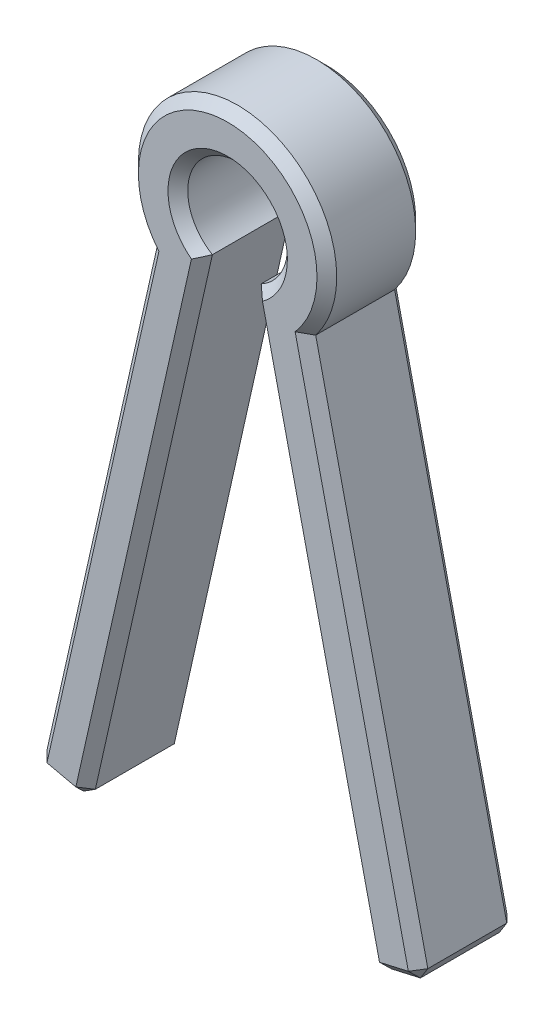
ISO-10303-21;
HEADER;
FILE_DESCRIPTION(('STEP AP214'),'2;1');
FILE_NAME('part.step','',(''),(''),'','','');
FILE_SCHEMA(('AUTOMOTIVE_DESIGN { 1 0 10303 214 1 1 1 1 }'));
ENDSEC;
DATA;
#1=APPLICATION_CONTEXT('core data for automotive mechanical design processes');
#2=APPLICATION_PROTOCOL_DEFINITION('international standard','automotive_design',2000,#1);
#3=PRODUCT_CONTEXT('',#1,'mechanical');
#4=PRODUCT('Part','Part','',(#3));
#5=PRODUCT_RELATED_PRODUCT_CATEGORY('part','',(#4));
#6=PRODUCT_DEFINITION_FORMATION('','',#4);
#7=PRODUCT_DEFINITION_CONTEXT('part definition',#1,'design');
#8=PRODUCT_DEFINITION('design','',#6,#7);
#9=PRODUCT_DEFINITION_SHAPE('','',#8);
#10=(LENGTH_UNIT() NAMED_UNIT(*) SI_UNIT(.MILLI.,.METRE.));
#11=(NAMED_UNIT(*) PLANE_ANGLE_UNIT() SI_UNIT($,.RADIAN.));
#12=(NAMED_UNIT(*) SI_UNIT($,.STERADIAN.) SOLID_ANGLE_UNIT());
#13=UNCERTAINTY_MEASURE_WITH_UNIT(LENGTH_MEASURE(1.E-05),#10,'distance_accuracy_value','');
#14=(GEOMETRIC_REPRESENTATION_CONTEXT(3) GLOBAL_UNCERTAINTY_ASSIGNED_CONTEXT((#13)) GLOBAL_UNIT_ASSIGNED_CONTEXT((#10,
#11,#12)) REPRESENTATION_CONTEXT('',''));
#15=CARTESIAN_POINT('',(0.,0.,0.));
#16=DIRECTION('',(0.,0.,1.));
#17=DIRECTION('',(1.,0.,0.));
#18=AXIS2_PLACEMENT_3D('',#15,#16,#17);
#19=CARTESIAN_POINT('',(-7.42970161226494,-3.26346952908523,10.));
#20=DIRECTION('',(0.975732833497163,-0.218964466604965,0.));
#21=DIRECTION('',(0.218964466604965,0.975732833497163,0.));
#22=AXIS2_PLACEMENT_3D('',#19,#20,#21);
#23=PLANE('',#22);
#24=DIRECTION('',(0.,0.,-1.));
#25=VECTOR('',#24,1.);
#26=CARTESIAN_POINT('',(-8.04810955980083,-6.01917207873661,10.));
#27=LINE('',#26,#25);
#28=CARTESIAN_POINT('',(-8.04810955980083,-6.01917207873661,8.99999999999999));
#29=VERTEX_POINT('',#28);
#30=CARTESIAN_POINT('',(-8.04810955980083,-6.01917207873661,1.00000000000001));
#31=VERTEX_POINT('',#30);
#32=EDGE_CURVE('E482',#29,#31,#27,.T.);
#33=ORIENTED_EDGE('',*,*,#32,.T.);
#34=DIRECTION('',(-0.218964466604965,-0.975732833497163,0.));
#35=VECTOR('',#34,1.);
#36=CARTESIAN_POINT('',(-7.42970161226494,-3.26346952908523,1.00000000000001));
#37=LINE('',#36,#35);
#38=CARTESIAN_POINT('',(-19.2908427998453,-56.1181864560429,1.00000000000001));
#39=VERTEX_POINT('',#38);
#40=EDGE_CURVE('E270',#31,#39,#37,.T.);
#41=ORIENTED_EDGE('',*,*,#40,.T.);
#42=DIRECTION('',(0.,0.,1.));
#43=VECTOR('',#42,1.);
#44=CARTESIAN_POINT('',(-19.2908427998453,-56.1181864560429,10.));
#45=LINE('',#44,#43);
#46=CARTESIAN_POINT('',(-19.2908427998453,-56.1181864560429,8.99999999999999));
#47=VERTEX_POINT('',#46);
#48=EDGE_CURVE('E266',#39,#47,#45,.T.);
#49=ORIENTED_EDGE('',*,*,#48,.T.);
#50=DIRECTION('',(0.218964466604965,0.975732833497163,0.));
#51=VECTOR('',#50,1.);
#52=CARTESIAN_POINT('',(-8.04810955980083,-6.01917207873661,8.99999999999999));
#53=LINE('',#52,#51);
#54=EDGE_CURVE('E268',#47,#29,#53,.T.);
#55=ORIENTED_EDGE('',*,*,#54,.T.);
#56=EDGE_LOOP('',(#33,#41,#49,#55));
#57=FACE_BOUND('',#56,.T.);
#58=ADVANCED_FACE('F43',(#57),#23,.F.);
#59=CARTESIAN_POINT('',(-14.6311430989645,-58.188741622565,10.));
#60=DIRECTION('',(-0.218964466604966,-0.975732833497163,0.));
#61=DIRECTION('',(0.975732833497163,-0.218964466604966,0.));
#62=AXIS2_PLACEMENT_3D('',#59,#60,#61);
#63=PLANE('',#62);
#64=DIRECTION('',(0.,0.,-1.));
#65=VECTOR('',#64,1.);
#66=CARTESIAN_POINT('',(-18.5340744329531,-57.3128837561451,0.));
#67=LINE('',#66,#65);
#68=CARTESIAN_POINT('',(-18.5340744329531,-57.3128837561451,8.99999999999999));
#69=VERTEX_POINT('',#68);
#70=CARTESIAN_POINT('',(-18.5340744329531,-57.3128837561451,1.00000000000001));
#71=VERTEX_POINT('',#70);
#72=EDGE_CURVE('E217',#69,#71,#67,.T.);
#73=ORIENTED_EDGE('',*,*,#72,.T.);
#74=DIRECTION('',(0.975732833497163,-0.218964466604966,0.));
#75=VECTOR('',#74,1.);
#76=CARTESIAN_POINT('',(-14.6311430989645,-58.188741622565,1.00000000000001));
#77=LINE('',#76,#75);
#78=CARTESIAN_POINT('',(-15.6068759324617,-57.96977715596,1.00000000000001));
#79=VERTEX_POINT('',#78);
#80=EDGE_CURVE('E188',#71,#79,#77,.T.);
#81=ORIENTED_EDGE('',*,*,#80,.T.);
#82=DIRECTION('',(0.,0.,1.));
#83=VECTOR('',#82,1.);
#84=CARTESIAN_POINT('',(-15.6068759324617,-57.96977715596,10.));
#85=LINE('',#84,#83);
#86=CARTESIAN_POINT('',(-15.6068759324617,-57.96977715596,8.99999999999999));
#87=VERTEX_POINT('',#86);
#88=EDGE_CURVE('E226',#79,#87,#85,.T.);
#89=ORIENTED_EDGE('',*,*,#88,.T.);
#90=DIRECTION('',(-0.975732833497163,0.218964466604966,0.));
#91=VECTOR('',#90,1.);
#92=CARTESIAN_POINT('',(-14.6311430989645,-58.188741622565,8.99999999999999));
#93=LINE('',#92,#91);
#94=EDGE_CURVE('E219',#87,#69,#93,.T.);
#95=ORIENTED_EDGE('',*,*,#94,.T.);
#96=EDGE_LOOP('',(#73,#81,#89,#95));
#97=FACE_BOUND('',#96,.T.);
#98=ADVANCED_FACE('F526',(#97),#63,.T.);
#99=CARTESIAN_POINT('',(-2.55103744477913,-4.35829186211006,10.));
#100=DIRECTION('',(0.975732833497163,-0.218964466604965,0.));
#101=DIRECTION('',(0.218964466604965,0.975732833497163,0.));
#102=AXIS2_PLACEMENT_3D('',#99,#100,#101);
#103=PLANE('',#102);
#104=DIRECTION('',(0.,0.,-1.));
#105=VECTOR('',#104,1.);
#106=CARTESIAN_POINT('',(-14.4121786323595,-57.2130087890678,10.));
#107=LINE('',#106,#105);
#108=CARTESIAN_POINT('',(-14.4121786323595,-57.2130087890678,8.99999999999999));
#109=VERTEX_POINT('',#108);
#110=CARTESIAN_POINT('',(-14.4121786323595,-57.2130087890678,1.00000000000001));
#111=VERTEX_POINT('',#110);
#112=EDGE_CURVE('E229',#109,#111,#107,.T.);
#113=ORIENTED_EDGE('',*,*,#112,.T.);
#114=DIRECTION('',(0.218964466604965,0.975732833497163,0.));
#115=VECTOR('',#114,1.);
#116=CARTESIAN_POINT('',(-2.55103744477913,-4.35829186211006,1.00000000000001));
#117=LINE('',#116,#115);
#118=CARTESIAN_POINT('',(-2.55103744477913,-4.35829186211006,1.00000000000001));
#119=VERTEX_POINT('',#118);
#120=EDGE_CURVE('E233',#111,#119,#117,.T.);
#121=ORIENTED_EDGE('',*,*,#120,.T.);
#122=DIRECTION('',(0.,0.,-1.));
#123=VECTOR('',#122,1.);
#124=CARTESIAN_POINT('',(-2.55103744477913,-4.35829186211006,10.));
#125=LINE('',#124,#123);
#126=CARTESIAN_POINT('',(-2.55103744477913,-4.35829186211006,8.99999999999999));
#127=VERTEX_POINT('',#126);
#128=EDGE_CURVE('E211',#127,#119,#125,.T.);
#129=ORIENTED_EDGE('',*,*,#128,.F.);
#130=DIRECTION('',(-0.218964466604965,-0.975732833497163,0.));
#131=VECTOR('',#130,1.);
#132=CARTESIAN_POINT('',(-2.55103744477913,-4.35829186211006,8.99999999999999));
#133=LINE('',#132,#131);
#134=EDGE_CURVE('E231',#127,#109,#133,.T.);
#135=ORIENTED_EDGE('',*,*,#134,.T.);
#136=EDGE_LOOP('',(#113,#121,#129,#135));
#137=FACE_BOUND('',#136,.T.);
#138=ADVANCED_FACE('F596',(#137),#103,.T.);
#139=CARTESIAN_POINT('',(0.,0.,10.));
#140=DIRECTION('',(0.,0.,-1.));
#141=DIRECTION('',(-1.,0.,0.));
#142=AXIS2_PLACEMENT_3D('',#139,#140,#141);
#143=CYLINDRICAL_SURFACE('',#142,5.05);
#144=ORIENTED_EDGE('',*,*,#128,.T.);
#145=CARTESIAN_POINT('',(0.,0.,1.00000000000001));
#146=DIRECTION('',(0.,0.,1.));
#147=DIRECTION('',(1.,0.,0.));
#148=AXIS2_PLACEMENT_3D('',#145,#146,#147);
#149=CIRCLE('',#148,5.05);
#150=CARTESIAN_POINT('',(2.39448426325227,-4.44622818949244,1.00000000000001));
#151=VERTEX_POINT('',#150);
#152=EDGE_CURVE('E238',#119,#151,#149,.F.);
#153=ORIENTED_EDGE('',*,*,#152,.T.);
#154=DIRECTION('',(0.,0.,-1.));
#155=VECTOR('',#154,1.);
#156=CARTESIAN_POINT('',(2.39448426325227,-4.44622818949244,10.));
#157=LINE('',#156,#155);
#158=CARTESIAN_POINT('',(2.39448426325227,-4.44622818949244,8.99999999999999));
#159=VERTEX_POINT('',#158);
#160=EDGE_CURVE('E493',#159,#151,#157,.T.);
#161=ORIENTED_EDGE('',*,*,#160,.F.);
#162=CARTESIAN_POINT('',(0.,0.,8.99999999999999));
#163=DIRECTION('',(0.,0.,1.));
#164=DIRECTION('',(1.,0.,0.));
#165=AXIS2_PLACEMENT_3D('',#162,#163,#164);
#166=CIRCLE('',#165,5.05);
#167=EDGE_CURVE('E236',#159,#127,#166,.T.);
#168=ORIENTED_EDGE('',*,*,#167,.T.);
#169=EDGE_LOOP('',(#144,#153,#161,#168));
#170=FACE_BOUND('',#169,.T.);
#171=ADVANCED_FACE('F821',(#170),#143,.F.);
#172=CARTESIAN_POINT('',(2.39448426325227,-4.44622818949244,10.));
#173=DIRECTION('',(-0.975044750681601,-0.222008410129558,0.));
#174=DIRECTION('',(0.222008410129558,-0.975044750681601,0.));
#175=AXIS2_PLACEMENT_3D('',#172,#173,#174);
#176=PLANE('',#175);
#177=ORIENTED_EDGE('',*,*,#160,.T.);
#178=DIRECTION('',(0.222008410129558,-0.975044750681601,0.));
#179=VECTOR('',#178,1.);
#180=CARTESIAN_POINT('',(14.6311430989645,-58.188741622565,1.00000000000001));
#181=LINE('',#180,#179);
#182=CARTESIAN_POINT('',(14.4091346888349,-57.2136968718833,1.00000000000001));
#183=VERTEX_POINT('',#182);
#184=EDGE_CURVE('E244',#151,#183,#181,.T.);
#185=ORIENTED_EDGE('',*,*,#184,.T.);
#186=DIRECTION('',(0.,0.,1.));
#187=VECTOR('',#186,1.);
#188=CARTESIAN_POINT('',(14.4091346888349,-57.2136968718833,10.));
#189=LINE('',#188,#187);
#190=CARTESIAN_POINT('',(14.4091346888349,-57.2136968718833,8.99999999999999));
#191=VERTEX_POINT('',#190);
#192=EDGE_CURVE('E242',#183,#191,#189,.T.);
#193=ORIENTED_EDGE('',*,*,#192,.T.);
#194=DIRECTION('',(-0.222008410129558,0.975044750681601,0.));
#195=VECTOR('',#194,1.);
#196=CARTESIAN_POINT('',(2.39448426325227,-4.44622818949244,8.99999999999999));
#197=LINE('',#196,#195);
#198=EDGE_CURVE('E240',#191,#159,#197,.T.);
#199=ORIENTED_EDGE('',*,*,#198,.T.);
#200=EDGE_LOOP('',(#177,#185,#193,#199));
#201=FACE_BOUND('',#200,.T.);
#202=ADVANCED_FACE('F812',(#201),#176,.T.);
#203=CARTESIAN_POINT('',(19.5063668523725,-57.0786995719172,10.));
#204=DIRECTION('',(0.222008410129558,-0.975044750681601,0.));
#205=DIRECTION('',(0.975044750681601,0.222008410129558,0.));
#206=AXIS2_PLACEMENT_3D('',#203,#204,#205);
#207=PLANE('',#206);
#208=DIRECTION('',(0.,0.,-1.));
#209=VECTOR('',#208,1.);
#210=CARTESIAN_POINT('',(15.6061878496461,-57.9667332124354,10.));
#211=LINE('',#210,#209);
#212=CARTESIAN_POINT('',(15.6061878496461,-57.9667332124354,8.99999999999999));
#213=VERTEX_POINT('',#212);
#214=CARTESIAN_POINT('',(15.6061878496461,-57.9667332124354,1.00000000000001));
#215=VERTEX_POINT('',#214);
#216=EDGE_CURVE('E246',#213,#215,#211,.T.);
#217=ORIENTED_EDGE('',*,*,#216,.T.);
#218=DIRECTION('',(0.975044750681601,0.222008410129558,0.));
#219=VECTOR('',#218,1.);
#220=CARTESIAN_POINT('',(19.5063668523725,-57.0786995719172,1.00000000000001));
#221=LINE('',#220,#219);
#222=CARTESIAN_POINT('',(18.5313221016909,-57.3007079820467,1.00000000000001));
#223=VERTEX_POINT('',#222);
#224=EDGE_CURVE('E252',#215,#223,#221,.T.);
#225=ORIENTED_EDGE('',*,*,#224,.T.);
#226=DIRECTION('',(0.,0.,1.));
#227=VECTOR('',#226,1.);
#228=CARTESIAN_POINT('',(18.5313221016909,-57.3007079820467,10.));
#229=LINE('',#228,#227);
#230=CARTESIAN_POINT('',(18.5313221016909,-57.3007079820467,8.99999999999999));
#231=VERTEX_POINT('',#230);
#232=EDGE_CURVE('E250',#223,#231,#229,.T.);
#233=ORIENTED_EDGE('',*,*,#232,.T.);
#234=DIRECTION('',(-0.975044750681601,-0.222008410129558,0.));
#235=VECTOR('',#234,1.);
#236=CARTESIAN_POINT('',(19.5063668523725,-57.0786995719172,8.99999999999999));
#237=LINE('',#236,#235);
#238=EDGE_CURVE('E248',#231,#213,#237,.T.);
#239=ORIENTED_EDGE('',*,*,#238,.T.);
#240=EDGE_LOOP('',(#217,#225,#233,#239));
#241=FACE_BOUND('',#240,.T.);
#242=ADVANCED_FACE('F804',(#241),#207,.T.);
#243=CARTESIAN_POINT('',(7.26970801666028,-3.33618613884465,10.));
#244=DIRECTION('',(-0.975044750681601,-0.222008410129558,0.));
#245=DIRECTION('',(0.222008410129558,-0.975044750681601,0.));
#246=AXIS2_PLACEMENT_3D('',#243,#244,#245);
#247=PLANE('',#246);
#248=DIRECTION('',(0.,0.,-1.));
#249=VECTOR('',#248,1.);
#250=CARTESIAN_POINT('',(19.2843584422429,-56.1036548212355,0.));
#251=LINE('',#250,#249);
#252=CARTESIAN_POINT('',(19.2843584422429,-56.1036548212355,8.99999999999999));
#253=VERTEX_POINT('',#252);
#254=CARTESIAN_POINT('',(19.2843584422429,-56.1036548212355,1.00000000000001));
#255=VERTEX_POINT('',#254);
#256=EDGE_CURVE('E255',#253,#255,#251,.T.);
#257=ORIENTED_EDGE('',*,*,#256,.T.);
#258=DIRECTION('',(-0.222008410129558,0.975044750681601,0.));
#259=VECTOR('',#258,1.);
#260=CARTESIAN_POINT('',(7.26970801666028,-3.33618613884465,1.00000000000001));
#261=LINE('',#260,#259);
#262=CARTESIAN_POINT('',(7.91903859308448,-6.18799868788275,1.00000000000001));
#263=VERTEX_POINT('',#262);
#264=EDGE_CURVE('E259',#255,#263,#261,.T.);
#265=ORIENTED_EDGE('',*,*,#264,.T.);
#266=DIRECTION('',(0.,0.,-1.));
#267=VECTOR('',#266,1.);
#268=CARTESIAN_POINT('',(7.91903859308448,-6.18799868788275,10.));
#269=LINE('',#268,#267);
#270=CARTESIAN_POINT('',(7.91903859308448,-6.18799868788275,8.99999999999999));
#271=VERTEX_POINT('',#270);
#272=EDGE_CURVE('E488',#271,#263,#269,.T.);
#273=ORIENTED_EDGE('',*,*,#272,.F.);
#274=DIRECTION('',(0.222008410129558,-0.975044750681601,0.));
#275=VECTOR('',#274,1.);
#276=CARTESIAN_POINT('',(19.5063668523725,-57.0786995719172,8.99999999999999));
#277=LINE('',#276,#275);
#278=EDGE_CURVE('E257',#271,#253,#277,.T.);
#279=ORIENTED_EDGE('',*,*,#278,.T.);
#280=EDGE_LOOP('',(#257,#265,#273,#279));
#281=FACE_BOUND('',#280,.T.);
#282=ADVANCED_FACE('F553',(#281),#247,.F.);
#283=CARTESIAN_POINT('',(0.,0.,10.));
#284=DIRECTION('',(0.,0.,-1.));
#285=DIRECTION('',(-1.,0.,0.));
#286=AXIS2_PLACEMENT_3D('',#283,#284,#285);
#287=CYLINDRICAL_SURFACE('',#286,10.05);
#288=ORIENTED_EDGE('',*,*,#272,.T.);
#289=CARTESIAN_POINT('',(0.,0.,1.00000000000001));
#290=DIRECTION('',(0.,0.,1.));
#291=DIRECTION('',(1.,0.,0.));
#292=AXIS2_PLACEMENT_3D('',#289,#290,#291);
#293=CIRCLE('',#292,10.05);
#294=EDGE_CURVE('E264',#263,#31,#293,.T.);
#295=ORIENTED_EDGE('',*,*,#294,.T.);
#296=ORIENTED_EDGE('',*,*,#32,.F.);
#297=CARTESIAN_POINT('',(0.,0.,8.99999999999999));
#298=DIRECTION('',(0.,0.,1.));
#299=DIRECTION('',(1.,0.,0.));
#300=AXIS2_PLACEMENT_3D('',#297,#298,#299);
#301=CIRCLE('',#300,10.05);
#302=EDGE_CURVE('E262',#29,#271,#301,.F.);
#303=ORIENTED_EDGE('',*,*,#302,.T.);
#304=EDGE_LOOP('',(#288,#295,#296,#303));
#305=FACE_BOUND('',#304,.T.);
#306=ADVANCED_FACE('F558',(#305),#287,.T.);
#307=CARTESIAN_POINT('',(0.,0.,10.));
#308=DIRECTION('',(0.,0.,1.));
#309=DIRECTION('',(1.,0.,0.));
#310=AXIS2_PLACEMENT_3D('',#307,#308,#309);
#311=PLANE('',#310);
#312=DIRECTION('',(-0.222008410129558,0.975044750681601,0.));
#313=VECTOR('',#312,1.);
#314=CARTESIAN_POINT('',(6.94399384240286,-6.41000709801231,10.));
#315=LINE('',#314,#313);
#316=CARTESIAN_POINT('',(18.3093136915613,-56.3256632313651,10.));
#317=VERTEX_POINT('',#316);
#318=CARTESIAN_POINT('',(6.83507280045463,-5.93163382319619,10.));
#319=VERTEX_POINT('',#318);
#320=EDGE_CURVE('E53',#317,#319,#315,.T.);
#321=ORIENTED_EDGE('',*,*,#320,.T.);
#322=CARTESIAN_POINT('',(0.,0.,10.));
#323=DIRECTION('',(0.,0.,1.));
#324=DIRECTION('',(1.,0.,0.));
#325=AXIS2_PLACEMENT_3D('',#322,#323,#324);
#326=CIRCLE('',#325,9.04999999999998);
#327=CARTESIAN_POINT('',(-6.96833192392543,-5.77449999549757,10.));
#328=VERTEX_POINT('',#327);
#329=EDGE_CURVE('E11',#319,#328,#326,.T.);
#330=ORIENTED_EDGE('',*,*,#329,.T.);
#331=DIRECTION('',(-0.218964466604965,-0.975732833497163,0.));
#332=VECTOR('',#331,1.);
#333=CARTESIAN_POINT('',(-18.5340744329531,-57.3128837561451,10.));
#334=LINE('',#333,#332);
#335=CARTESIAN_POINT('',(-18.3151099663482,-56.3371509226479,10.));
#336=VERTEX_POINT('',#335);
#337=EDGE_CURVE('E272',#328,#336,#334,.T.);
#338=ORIENTED_EDGE('',*,*,#337,.T.);
#339=DIRECTION('',(0.975732833497163,-0.218964466604966,0.));
#340=VECTOR('',#339,1.);
#341=CARTESIAN_POINT('',(-12.9146044219748,-57.5490798188833,10.));
#342=LINE('',#341,#340);
#343=CARTESIAN_POINT('',(-15.3879114658567,-56.9940443224628,10.));
#344=VERTEX_POINT('',#343);
#345=EDGE_CURVE('E274',#336,#344,#342,.T.);
#346=ORIENTED_EDGE('',*,*,#345,.T.);
#347=DIRECTION('',(0.218964466604965,0.975732833497163,0.));
#348=VECTOR('',#347,1.);
#349=CARTESIAN_POINT('',(-2.473307043882,0.555035496420548,10.));
#350=LINE('',#349,#348);
#351=CARTESIAN_POINT('',(-3.67616134876274,-4.80503254285161,10.));
#352=VERTEX_POINT('',#351);
#353=EDGE_CURVE('E276',#344,#352,#350,.T.);
#354=ORIENTED_EDGE('',*,*,#353,.T.);
#355=CARTESIAN_POINT('',(0.,0.,10.));
#356=DIRECTION('',(0.,0.,1.));
#357=DIRECTION('',(1.,0.,0.));
#358=AXIS2_PLACEMENT_3D('',#355,#356,#357);
#359=CIRCLE('',#358,6.05000000000001);
#360=CARTESIAN_POINT('',(3.5269497576461,-4.91560020821875,10.));
#361=VERTEX_POINT('',#360);
#362=EDGE_CURVE('E278',#352,#361,#359,.F.);
#363=ORIENTED_EDGE('',*,*,#362,.T.);
#364=DIRECTION('',(0.222008410129558,-0.975044750681601,0.));
#365=VECTOR('',#364,1.);
#366=CARTESIAN_POINT('',(2.28904358655966,0.521193439597643,10.));
#367=LINE('',#366,#365);
#368=CARTESIAN_POINT('',(15.3841794395165,-56.9916884617538,10.));
#369=VERTEX_POINT('',#368);
#370=EDGE_CURVE('E280',#361,#369,#367,.T.);
#371=ORIENTED_EDGE('',*,*,#370,.T.);
#372=DIRECTION('',(0.975044750681601,0.222008410129558,0.));
#373=VECTOR('',#372,1.);
#374=CARTESIAN_POINT('',(13.0951358529569,-57.5128819013514,10.));
#375=LINE('',#374,#373);
#376=EDGE_CURVE('E64',#369,#317,#375,.T.);
#377=ORIENTED_EDGE('',*,*,#376,.T.);
#378=EDGE_LOOP('',(#321,#330,#338,#346,#354,#363,#371,#377));
#379=FACE_BOUND('',#378,.T.);
#380=ADVANCED_FACE('F582',(#379),#311,.T.);
#381=CARTESIAN_POINT('',(0.,0.,0.));
#382=DIRECTION('',(0.,0.,1.));
#383=DIRECTION('',(1.,0.,0.));
#384=AXIS2_PLACEMENT_3D('',#381,#382,#383);
#385=PLANE('',#384);
#386=DIRECTION('',(-0.218964466604965,-0.975732833497163,0.));
#387=VECTOR('',#386,1.);
#388=CARTESIAN_POINT('',(-15.6068759324617,-57.96977715596,0.));
#389=LINE('',#388,#387);
#390=CARTESIAN_POINT('',(-3.67616134876275,-4.80503254285161,0.));
#391=VERTEX_POINT('',#390);
#392=CARTESIAN_POINT('',(-15.3879114658567,-56.9940443224628,0.));
#393=VERTEX_POINT('',#392);
#394=EDGE_CURVE('E215',#391,#393,#389,.T.);
#395=ORIENTED_EDGE('',*,*,#394,.T.);
#396=DIRECTION('',(-0.975732833497163,0.218964466604966,0.));
#397=VECTOR('',#396,1.);
#398=CARTESIAN_POINT('',(-19.2908427998453,-56.1181864560429,0.));
#399=LINE('',#398,#397);
#400=CARTESIAN_POINT('',(-18.3151099663482,-56.3371509226479,0.));
#401=VERTEX_POINT('',#400);
#402=EDGE_CURVE('E186',#393,#401,#399,.T.);
#403=ORIENTED_EDGE('',*,*,#402,.T.);
#404=DIRECTION('',(0.218964466604965,0.975732833497163,0.));
#405=VECTOR('',#404,1.);
#406=CARTESIAN_POINT('',(-5.40050554437346,1.21192889623544,0.));
#407=LINE('',#406,#405);
#408=CARTESIAN_POINT('',(-6.96833192392543,-5.77449999549758,0.));
#409=VERTEX_POINT('',#408);
#410=EDGE_CURVE('E204',#401,#409,#407,.T.);
#411=ORIENTED_EDGE('',*,*,#410,.T.);
#412=CARTESIAN_POINT('',(0.,0.,0.));
#413=DIRECTION('',(0.,0.,1.));
#414=DIRECTION('',(1.,0.,0.));
#415=AXIS2_PLACEMENT_3D('',#412,#413,#414);
#416=CIRCLE('',#415,9.04999999999999);
#417=CARTESIAN_POINT('',(6.83507280045463,-5.93163382319619,0.));
#418=VERTEX_POINT('',#417);
#419=EDGE_CURVE('E210',#409,#418,#416,.F.);
#420=ORIENTED_EDGE('',*,*,#419,.T.);
#421=DIRECTION('',(0.222008410129558,-0.975044750681601,0.));
#422=VECTOR('',#421,1.);
#423=CARTESIAN_POINT('',(5.21417783860444,1.18721866998631,0.));
#424=LINE('',#423,#422);
#425=CARTESIAN_POINT('',(18.3093136915613,-56.3256632313651,0.));
#426=VERTEX_POINT('',#425);
#427=EDGE_CURVE('E501',#418,#426,#424,.T.);
#428=ORIENTED_EDGE('',*,*,#427,.T.);
#429=DIRECTION('',(-0.975044750681601,-0.222008410129558,0.));
#430=VECTOR('',#429,1.);
#431=CARTESIAN_POINT('',(14.4091346888349,-57.2136968718833,0.));
#432=LINE('',#431,#430);
#433=CARTESIAN_POINT('',(15.3841794395165,-56.9916884617538,0.));
#434=VERTEX_POINT('',#433);
#435=EDGE_CURVE('E503',#426,#434,#432,.T.);
#436=ORIENTED_EDGE('',*,*,#435,.T.);
#437=DIRECTION('',(-0.222008410129558,0.975044750681601,0.));
#438=VECTOR('',#437,1.);
#439=CARTESIAN_POINT('',(3.36952901393389,-4.22421977936288,0.));
#440=LINE('',#439,#438);
#441=CARTESIAN_POINT('',(3.5269497576461,-4.91560020821875,0.));
#442=VERTEX_POINT('',#441);
#443=EDGE_CURVE('E505',#434,#442,#440,.T.);
#444=ORIENTED_EDGE('',*,*,#443,.T.);
#445=CARTESIAN_POINT('',(0.,0.,0.));
#446=DIRECTION('',(0.,0.,1.));
#447=DIRECTION('',(1.,0.,0.));
#448=AXIS2_PLACEMENT_3D('',#445,#446,#447);
#449=CIRCLE('',#448,6.05000000000001);
#450=EDGE_CURVE('E221',#442,#391,#449,.T.);
#451=ORIENTED_EDGE('',*,*,#450,.T.);
#452=EDGE_LOOP('',(#395,#403,#411,#420,#428,#436,#444,#451));
#453=FACE_BOUND('',#452,.T.);
#454=ADVANCED_FACE('F213',(#453),#385,.F.);
#455=CARTESIAN_POINT('',(19.5063668523725,-57.0786995719172,8.99999999999999));
#456=DIRECTION('',(-0.156983652283054,0.689460755167302,-0.707106781186552));
#457=DIRECTION('',(-0.975044750681601,-0.222008410129558,0.));
#458=AXIS2_PLACEMENT_3D('',#455,#456,#457);
#459=PLANE('',#458);
#460=DIRECTION('',(0.156983652283066,-0.689460755167309,-0.707106781186543));
#461=VECTOR('',#460,1.);
#462=CARTESIAN_POINT('',(15.6061878496461,-57.9667332124354,8.99999999999999));
#463=LINE('',#462,#461);
#464=EDGE_CURVE('E48',#213,#369,#463,.F.);
#465=ORIENTED_EDGE('',*,*,#464,.F.);
#466=ORIENTED_EDGE('',*,*,#238,.F.);
#467=DIRECTION('',(-0.156983652283053,0.689460755167312,0.707106781186543));
#468=VECTOR('',#467,1.);
#469=CARTESIAN_POINT('',(18.4203178966261,-56.8131856067059,9.5));
#470=LINE('',#469,#468);
#471=EDGE_CURVE('E476',#317,#231,#470,.F.);
#472=ORIENTED_EDGE('',*,*,#471,.F.);
#473=ORIENTED_EDGE('',*,*,#376,.F.);
#474=EDGE_LOOP('',(#465,#466,#472,#473));
#475=FACE_BOUND('',#474,.T.);
#476=ADVANCED_FACE('F46',(#475),#459,.F.);
#477=CARTESIAN_POINT('',(15.6061878496461,-57.9667332124354,8.99999999999999));
#478=DIRECTION('',(-0.434765733927295,-0.691118964628615,0.577350269189624));
#479=DIRECTION('',(0.,-0.641113074277184,-0.767446432000865));
#480=AXIS2_PLACEMENT_3D('',#477,#478,#479);
#481=PLANE('',#480);
#482=DIRECTION('',(-0.846444407450359,0.532477102884256,0.));
#483=VECTOR('',#482,1.);
#484=CARTESIAN_POINT('',(15.6061878496461,-57.9667332124354,8.99999999999998));
#485=LINE('',#484,#483);
#486=EDGE_CURVE('E471',#213,#191,#485,.T.);
#487=ORIENTED_EDGE('',*,*,#486,.F.);
#488=ORIENTED_EDGE('',*,*,#464,.T.);
#489=DIRECTION('',(0.689460755167306,0.156983652283053,0.707106781186549));
#490=VECTOR('',#489,1.);
#491=CARTESIAN_POINT('',(14.8966570641757,-57.1026926668185,9.5));
#492=LINE('',#491,#490);
#493=EDGE_CURVE('E474',#191,#369,#492,.T.);
#494=ORIENTED_EDGE('',*,*,#493,.F.);
#495=EDGE_LOOP('',(#487,#488,#494));
#496=FACE_BOUND('',#495,.T.);
#497=ADVANCED_FACE('F769',(#496),#481,.T.);
#498=CARTESIAN_POINT('',(19.2843584422429,-56.1036548212355,8.99999999999999));
#499=DIRECTION('',(0.691118964628614,-0.434765733927291,0.577350269189629));
#500=DIRECTION('',(0.641113074277188,0.,-0.767446432000862));
#501=AXIS2_PLACEMENT_3D('',#498,#499,#500);
#502=PLANE('',#501);
#503=DIRECTION('',(-0.689460755167308,-0.156983652283051,0.707106781186547));
#504=VECTOR('',#503,1.);
#505=CARTESIAN_POINT('',(19.2843584422429,-56.1036548212355,8.99999999999999));
#506=LINE('',#505,#504);
#507=EDGE_CURVE('E463',#317,#253,#506,.F.);
#508=ORIENTED_EDGE('',*,*,#507,.F.);
#509=ORIENTED_EDGE('',*,*,#471,.T.);
#510=DIRECTION('',(0.532477102884247,0.846444407450365,0.));
#511=VECTOR('',#510,1.);
#512=CARTESIAN_POINT('',(19.2843584422429,-56.1036548212355,8.99999999999999));
#513=LINE('',#512,#511);
#514=EDGE_CURVE('E468',#253,#231,#513,.F.);
#515=ORIENTED_EDGE('',*,*,#514,.F.);
#516=EDGE_LOOP('',(#508,#509,#515));
#517=FACE_BOUND('',#516,.T.);
#518=ADVANCED_FACE('F451',(#517),#502,.T.);
#519=CARTESIAN_POINT('',(2.39448426325227,-4.44622818949244,8.99999999999999));
#520=DIRECTION('',(0.689460755167308,0.156983652283055,-0.707106781186546));
#521=DIRECTION('',(-0.222008410129558,0.975044750681601,0.));
#522=AXIS2_PLACEMENT_3D('',#519,#520,#521);
#523=PLANE('',#522);
#524=ORIENTED_EDGE('',*,*,#493,.T.);
#525=ORIENTED_EDGE('',*,*,#370,.F.);
#526=CARTESIAN_POINT('',(2.39448426325227,-4.44622818949244,8.99999999999999));
#527=CARTESIAN_POINT('',(2.48842208202326,-4.48890437137155,9.08211910579374));
#528=CARTESIAN_POINT('',(2.58249591812604,-4.53059850525504,9.16458885748703));
#529=CARTESIAN_POINT('',(2.7708598744635,-4.61215695867718,9.33014548175462));
#530=CARTESIAN_POINT('',(2.86514995147625,-4.65202161522999,9.41323223736561));
#531=CARTESIAN_POINT('',(3.05392156037154,-4.7300694829236,9.57996572067602));
#532=CARTESIAN_POINT('',(3.14840308427447,-4.76825276269612,9.66361242535814));
#533=CARTESIAN_POINT('',(3.33755003856936,-4.84306487688574,9.83143025172112));
#534=CARTESIAN_POINT('',(3.43221549973526,-4.87969342258298,9.91560146750618));
#535=CARTESIAN_POINT('',(3.5269497576461,-4.91560020821875,10.));
#536=B_SPLINE_CURVE_WITH_KNOTS('',3,(#526,#527,#528,#529,#530,#531,#532,#533,#534,#535),
.UNSPECIFIED.,.F.,.F.,(4,2,2,2,4),(0.,0.395595524733817,0.791117880542057,1.18662407662191,
1.58220340116721),.UNSPECIFIED.);
#537=EDGE_CURVE('E455',#159,#361,#536,.T.);
#538=ORIENTED_EDGE('',*,*,#537,.F.);
#539=ORIENTED_EDGE('',*,*,#198,.F.);
#540=EDGE_LOOP('',(#524,#525,#538,#539));
#541=FACE_BOUND('',#540,.T.);
#542=ADVANCED_FACE('F443',(#541),#523,.F.);
#543=CARTESIAN_POINT('',(15.6061878496461,-57.9667332124354,10.));
#544=DIRECTION('',(0.532477102884256,0.846444407450359,0.));
#545=DIRECTION('',(0.,0.,-1.));
#546=AXIS2_PLACEMENT_3D('',#543,#544,#545);
#547=PLANE('',#546);
#548=ORIENTED_EDGE('',*,*,#486,.T.);
#549=ORIENTED_EDGE('',*,*,#192,.F.);
#550=DIRECTION('',(0.846444407450359,-0.532477102884256,0.));
#551=VECTOR('',#550,1.);
#552=CARTESIAN_POINT('',(14.4091346888349,-57.2136968718833,1.00000000000001));
#553=LINE('',#552,#551);
#554=EDGE_CURVE('E464',#215,#183,#553,.F.);
#555=ORIENTED_EDGE('',*,*,#554,.F.);
#556=ORIENTED_EDGE('',*,*,#216,.F.);
#557=EDGE_LOOP('',(#548,#549,#555,#556));
#558=FACE_BOUND('',#557,.T.);
#559=ADVANCED_FACE('F450',(#558),#547,.F.);
#560=CARTESIAN_POINT('',(13.0951358529569,-57.5128819013514,0.));
#561=DIRECTION('',(0.156983652283053,-0.689460755167301,-0.707106781186554));
#562=DIRECTION('',(0.975044750681601,0.222008410129558,0.));
#563=AXIS2_PLACEMENT_3D('',#560,#561,#562);
#564=PLANE('',#563);
#565=DIRECTION('',(-0.156983652283054,0.689460755167313,-0.707106781186541));
#566=VECTOR('',#565,1.);
#567=CARTESIAN_POINT('',(18.5313221016909,-57.3007079820467,1.00000000000001));
#568=LINE('',#567,#566);
#569=EDGE_CURVE('E566',#223,#426,#568,.T.);
#570=ORIENTED_EDGE('',*,*,#569,.F.);
#571=ORIENTED_EDGE('',*,*,#224,.F.);
#572=DIRECTION('',(0.156983652283058,-0.689460755167312,0.707106781186542));
#573=VECTOR('',#572,1.);
#574=CARTESIAN_POINT('',(15.4951836445813,-57.4792108370946,0.499999999999995));
#575=LINE('',#574,#573);
#576=EDGE_CURVE('E870',#434,#215,#575,.T.);
#577=ORIENTED_EDGE('',*,*,#576,.F.);
#578=ORIENTED_EDGE('',*,*,#435,.F.);
#579=EDGE_LOOP('',(#570,#571,#577,#578));
#580=FACE_BOUND('',#579,.T.);
#581=ADVANCED_FACE('F742',(#580),#564,.T.);
#582=CARTESIAN_POINT('',(19.2843584422429,-56.1036548212355,10.));
#583=DIRECTION('',(0.846444407450364,-0.532477102884247,0.));
#584=DIRECTION('',(0.,0.,1.));
#585=AXIS2_PLACEMENT_3D('',#582,#583,#584);
#586=PLANE('',#585);
#587=ORIENTED_EDGE('',*,*,#514,.T.);
#588=ORIENTED_EDGE('',*,*,#232,.F.);
#589=DIRECTION('',(-0.532477102884247,-0.846444407450365,0.));
#590=VECTOR('',#589,1.);
#591=CARTESIAN_POINT('',(18.5313221016909,-57.3007079820467,1.00000000000002));
#592=LINE('',#591,#590);
#593=EDGE_CURVE('E408',#255,#223,#592,.T.);
#594=ORIENTED_EDGE('',*,*,#593,.F.);
#595=ORIENTED_EDGE('',*,*,#256,.F.);
#596=EDGE_LOOP('',(#587,#588,#594,#595));
#597=FACE_BOUND('',#596,.T.);
#598=ADVANCED_FACE('F427',(#597),#586,.T.);
#599=CARTESIAN_POINT('',(5.21417783860443,1.18721866998631,10.));
#600=DIRECTION('',(0.689460755167306,0.156983652283054,0.707106781186548));
#601=DIRECTION('',(0.222008410129558,-0.975044750681601,0.));
#602=AXIS2_PLACEMENT_3D('',#599,#600,#601);
#603=PLANE('',#602);
#604=ORIENTED_EDGE('',*,*,#507,.T.);
#605=ORIENTED_EDGE('',*,*,#278,.F.);
#606=CARTESIAN_POINT('',(7.91903859308448,-6.18799868788275,8.99999999999999));
#607=CARTESIAN_POINT('',(7.82869016569544,-6.16782191665216,9.08361434695555));
#608=CARTESIAN_POINT('',(7.73834427687053,-6.14736502006284,9.16716402851197));
#609=CARTESIAN_POINT('',(7.55766234930638,-6.10586681945308,9.33412404398582));
#610=CARTESIAN_POINT('',(7.46732631037563,-6.08482553024601,9.41753438137868));
#611=CARTESIAN_POINT('',(7.28666398979427,-6.04213329985476,9.58421019451344));
#612=CARTESIAN_POINT('',(7.19633770817585,-6.02048235671812,9.6674756697905));
#613=CARTESIAN_POINT('',(7.01569588328197,-5.97654295501182,9.83385461619196));
#614=CARTESIAN_POINT('',(6.92538034033644,-5.95425448030911,9.916968083413));
#615=CARTESIAN_POINT('',(6.83507280045463,-5.93163382319619,10.));
#616=B_SPLINE_CURVE_WITH_KNOTS('',3,(#606,#607,#608,#609,#610,#611,#612,#613,#614,#615),
.UNSPECIFIED.,.F.,.F.,(4,2,2,2,4),(0.,0.374234662220068,0.748459846863835,1.12268623012108,
1.49692209175231),.UNSPECIFIED.);
#617=EDGE_CURVE('E399',#319,#271,#616,.F.);
#618=ORIENTED_EDGE('',*,*,#617,.F.);
#619=ORIENTED_EDGE('',*,*,#320,.F.);
#620=EDGE_LOOP('',(#604,#605,#618,#619));
#621=FACE_BOUND('',#620,.T.);
#622=ADVANCED_FACE('F418',(#621),#603,.T.);
#623=CARTESIAN_POINT('',(0.,0.,8.99999999999999));
#624=DIRECTION('',(0.,0.,1.));
#625=DIRECTION('',(1.,0.,0.));
#626=AXIS2_PLACEMENT_3D('',#623,#624,#625);
#627=CONICAL_SURFACE('',#626,5.05,0.785398163397446);
#628=ORIENTED_EDGE('',*,*,#537,.T.);
#629=ORIENTED_EDGE('',*,*,#362,.F.);
#630=CARTESIAN_POINT('',(-2.55103744477913,-4.35829186211006,8.99999999999999));
#631=CARTESIAN_POINT('',(-2.64441673142411,-4.39890062365809,9.08222136013619));
#632=CARTESIAN_POINT('',(-2.73791560711622,-4.4385777459379,9.16476340312763));
#633=CARTESIAN_POINT('',(-2.92510290893356,-4.51619609449632,9.33041253923369));
#634=CARTESIAN_POINT('',(-3.01879130062327,-4.55413761091241,9.41351953521866));
#635=CARTESIAN_POINT('',(-3.20633589576196,-4.62842429334679,9.58024681064531));
#636=CARTESIAN_POINT('',(-3.30019209287526,-4.66476951836319,9.66386707098659));
#637=CARTESIAN_POINT('',(-3.48806593434992,-4.73598281468811,9.83158856522369));
#638=CARTESIAN_POINT('',(-3.58208360315006,-4.77085063721437,9.91568987743971));
#639=CARTESIAN_POINT('',(-3.67616134876274,-4.80503254285161,10.));
#640=B_SPLINE_CURVE_WITH_KNOTS('',3,(#630,#631,#632,#633,#634,#635,#636,#637,#638,#639),
.UNSPECIFIED.,.F.,.F.,(4,2,2,2,4),(0.,0.392627680765522,0.785189485143002,1.17773676840682,
1.57034989277139),.UNSPECIFIED.);
#641=EDGE_CURVE('E409',#127,#352,#640,.T.);
#642=ORIENTED_EDGE('',*,*,#641,.F.);
#643=ORIENTED_EDGE('',*,*,#167,.F.);
#644=EDGE_LOOP('',(#628,#629,#642,#643));
#645=FACE_BOUND('',#644,.T.);
#646=ADVANCED_FACE('F426',(#645),#627,.F.);
#647=CARTESIAN_POINT('',(14.4091346888349,-57.2136968718833,1.00000000000001));
#648=DIRECTION('',(-0.434765733927293,-0.691118964628612,-0.57735026918963));
#649=DIRECTION('',(0.,0.64111307427719,-0.76744643200086));
#650=AXIS2_PLACEMENT_3D('',#647,#648,#649);
#651=PLANE('',#650);
#652=ORIENTED_EDGE('',*,*,#576,.T.);
#653=ORIENTED_EDGE('',*,*,#554,.T.);
#654=DIRECTION('',(0.689460755167308,0.156983652283058,-0.707106781186546));
#655=VECTOR('',#654,1.);
#656=CARTESIAN_POINT('',(14.4091346888349,-57.2136968718833,1.00000000000001));
#657=LINE('',#656,#655);
#658=EDGE_CURVE('E568',#434,#183,#657,.F.);
#659=ORIENTED_EDGE('',*,*,#658,.F.);
#660=EDGE_LOOP('',(#652,#653,#659));
#661=FACE_BOUND('',#660,.T.);
#662=ADVANCED_FACE('F435',(#661),#651,.T.);
#663=CARTESIAN_POINT('',(18.5313221016909,-57.3007079820467,1.00000000000001));
#664=DIRECTION('',(0.691118964628616,-0.434765733927288,-0.577350269189629));
#665=DIRECTION('',(-0.641113074277187,0.,-0.767446432000862));
#666=AXIS2_PLACEMENT_3D('',#663,#664,#665);
#667=PLANE('',#666);
#668=ORIENTED_EDGE('',*,*,#593,.T.);
#669=ORIENTED_EDGE('',*,*,#569,.T.);
#670=DIRECTION('',(-0.689460755167307,-0.15698365228305,-0.707106781186549));
#671=VECTOR('',#670,1.);
#672=CARTESIAN_POINT('',(18.7968360669021,-56.2146590263003,0.50000000000001));
#673=LINE('',#672,#671);
#674=EDGE_CURVE('E567',#255,#426,#673,.T.);
#675=ORIENTED_EDGE('',*,*,#674,.F.);
#676=EDGE_LOOP('',(#668,#669,#675));
#677=FACE_BOUND('',#676,.T.);
#678=ADVANCED_FACE('F386',(#677),#667,.T.);
#679=CARTESIAN_POINT('',(0.,0.,10.));
#680=DIRECTION('',(0.,0.,-1.));
#681=DIRECTION('',(-1.,0.,0.));
#682=AXIS2_PLACEMENT_3D('',#679,#680,#681);
#683=CONICAL_SURFACE('',#682,9.04999999999998,0.78539816339745);
#684=ORIENTED_EDGE('',*,*,#617,.T.);
#685=ORIENTED_EDGE('',*,*,#302,.F.);
#686=CARTESIAN_POINT('',(-6.96833192392543,-5.77449999549757,10.));
#687=CARTESIAN_POINT('',(-7.05829646082235,-5.79609787159517,9.91694781491881));
#688=CARTESIAN_POINT('',(-7.14826726225651,-5.81737641271499,9.83381959430988));
#689=CARTESIAN_POINT('',(-7.32821662370999,-5.85932055081672,9.66742136979953));
#690=CARTESIAN_POINT('',(-7.41819518349728,-5.87998616219161,9.58415136927605));
#691=CARTESIAN_POINT('',(-7.59815925273951,-5.9207311188056,9.41747621575847));
#692=CARTESIAN_POINT('',(-7.68814476217302,-5.94081046578523,9.3340710631664));
#693=CARTESIAN_POINT('',(-7.86812290171384,-5.98040706675013,9.16713073171434));
#694=CARTESIAN_POINT('',(-7.9581155319388,-5.99992430751536,9.08359554984484));
#695=CARTESIAN_POINT('',(-8.04810955980083,-6.01917207873661,8.99999999999999));
#696=B_SPLINE_CURVE_WITH_KNOTS('',3,(#686,#687,#688,#689,#690,#691,#692,#693,#694,#695),
.UNSPECIFIED.,.F.,.F.,(4,2,2,2,4),(0.,0.372986972106551,0.745965178689005,1.11894227784376,
1.49192814179679),.UNSPECIFIED.);
#697=EDGE_CURVE('E392',#328,#29,#696,.T.);
#698=ORIENTED_EDGE('',*,*,#697,.F.);
#699=ORIENTED_EDGE('',*,*,#329,.F.);
#700=EDGE_LOOP('',(#684,#685,#698,#699));
#701=FACE_BOUND('',#700,.T.);
#702=ADVANCED_FACE('F379',(#701),#683,.T.);
#703=CARTESIAN_POINT('',(-2.55103744477913,-4.35829186211006,8.99999999999999));
#704=DIRECTION('',(-0.689947303192209,0.154831259175266,-0.707106781186547));
#705=DIRECTION('',(-0.218964466604965,-0.975732833497163,0.));
#706=AXIS2_PLACEMENT_3D('',#703,#704,#705);
#707=PLANE('',#706);
#708=ORIENTED_EDGE('',*,*,#641,.T.);
#709=ORIENTED_EDGE('',*,*,#353,.F.);
#710=DIRECTION('',(0.689947303192207,-0.154831259175269,-0.707106781186548));
#711=VECTOR('',#710,1.);
#712=CARTESIAN_POINT('',(-14.4121786323595,-57.2130087890678,8.99999999999999));
#713=LINE('',#712,#711);
#714=EDGE_CURVE('E342',#109,#344,#713,.F.);
#715=ORIENTED_EDGE('',*,*,#714,.F.);
#716=ORIENTED_EDGE('',*,*,#134,.F.);
#717=EDGE_LOOP('',(#708,#709,#715,#716));
#718=FACE_BOUND('',#717,.T.);
#719=ADVANCED_FACE('F361',(#718),#707,.F.);
#720=CARTESIAN_POINT('',(2.28904358655966,0.521193439597644,0.));
#721=DIRECTION('',(-0.689460755167305,-0.156983652283054,-0.707106781186549));
#722=DIRECTION('',(0.222008410129558,-0.975044750681601,0.));
#723=AXIS2_PLACEMENT_3D('',#720,#721,#722);
#724=PLANE('',#723);
#725=ORIENTED_EDGE('',*,*,#658,.T.);
#726=ORIENTED_EDGE('',*,*,#184,.F.);
#727=CARTESIAN_POINT('',(2.39448426325227,-4.44622818949244,1.00000000000001));
#728=CARTESIAN_POINT('',(2.48842208202326,-4.48890437137155,0.917880894206264));
#729=CARTESIAN_POINT('',(2.58249591812604,-4.53059850525504,0.835411142512968));
#730=CARTESIAN_POINT('',(2.7708598744635,-4.61215695867718,0.669854518245382));
#731=CARTESIAN_POINT('',(2.86514995147626,-4.65202161522999,0.586767762634386));
#732=CARTESIAN_POINT('',(3.05392156037154,-4.7300694829236,0.420034279323977));
#733=CARTESIAN_POINT('',(3.14840308427447,-4.76825276269612,0.336387574641856));
#734=CARTESIAN_POINT('',(3.33755003856937,-4.84306487688574,0.168569748278877));
#735=CARTESIAN_POINT('',(3.43221549973527,-4.87969342258298,0.0843985324938157));
#736=CARTESIAN_POINT('',(3.5269497576461,-4.91560020821875,0.));
#737=B_SPLINE_CURVE_WITH_KNOTS('',3,(#727,#728,#729,#730,#731,#732,#733,#734,#735,#736),
.UNSPECIFIED.,.F.,.F.,(4,2,2,2,4),(0.,0.395595524733816,0.791117880542056,1.18662407662191,
1.58220340116721),.UNSPECIFIED.);
#738=EDGE_CURVE('E333',#442,#151,#737,.F.);
#739=ORIENTED_EDGE('',*,*,#738,.F.);
#740=ORIENTED_EDGE('',*,*,#443,.F.);
#741=EDGE_LOOP('',(#725,#726,#739,#740));
#742=FACE_BOUND('',#741,.T.);
#743=ADVANCED_FACE('F352',(#742),#724,.T.);
#744=CARTESIAN_POINT('',(7.26970801666028,-3.33618613884465,1.00000000000001));
#745=DIRECTION('',(-0.689460755167308,-0.156983652283055,0.707106781186546));
#746=DIRECTION('',(-0.222008410129558,0.975044750681601,0.));
#747=AXIS2_PLACEMENT_3D('',#744,#745,#746);
#748=PLANE('',#747);
#749=ORIENTED_EDGE('',*,*,#674,.T.);
#750=ORIENTED_EDGE('',*,*,#427,.F.);
#751=CARTESIAN_POINT('',(7.91903859308448,-6.18799868788275,1.00000000000001));
#752=CARTESIAN_POINT('',(7.82869016569544,-6.16782191665216,0.91638565304445));
#753=CARTESIAN_POINT('',(7.73834427687053,-6.14736502006284,0.832835971488038));
#754=CARTESIAN_POINT('',(7.55766234930638,-6.10586681945308,0.665875956014187));
#755=CARTESIAN_POINT('',(7.46732631037563,-6.08482553024601,0.582465618621324));
#756=CARTESIAN_POINT('',(7.28666398979427,-6.04213329985476,0.415789805486563));
#757=CARTESIAN_POINT('',(7.19633770817585,-6.02048235671812,0.332524330209502));
#758=CARTESIAN_POINT('',(7.01569588328197,-5.97654295501182,0.16614538380804));
#759=CARTESIAN_POINT('',(6.92538034033644,-5.95425448030911,0.0830319165870035));
#760=CARTESIAN_POINT('',(6.83507280045463,-5.93163382319619,0.));
#761=B_SPLINE_CURVE_WITH_KNOTS('',3,(#751,#752,#753,#754,#755,#756,#757,#758,#759,#760),
.UNSPECIFIED.,.F.,.F.,(4,2,2,2,4),(0.,0.374234662220068,0.748459846863837,1.12268623012108,
1.49692209175231),.UNSPECIFIED.);
#762=EDGE_CURVE('E343',#263,#418,#761,.T.);
#763=ORIENTED_EDGE('',*,*,#762,.F.);
#764=ORIENTED_EDGE('',*,*,#264,.F.);
#765=EDGE_LOOP('',(#749,#750,#763,#764));
#766=FACE_BOUND('',#765,.T.);
#767=ADVANCED_FACE('F360',(#766),#748,.F.);
#768=CARTESIAN_POINT('',(-5.40050554437346,1.21192889623544,10.));
#769=DIRECTION('',(-0.689947303192207,0.154831259175266,0.707106781186549));
#770=DIRECTION('',(0.218964466604965,0.975732833497163,0.));
#771=AXIS2_PLACEMENT_3D('',#768,#769,#770);
#772=PLANE('',#771);
#773=ORIENTED_EDGE('',*,*,#697,.T.);
#774=ORIENTED_EDGE('',*,*,#54,.F.);
#775=DIRECTION('',(-0.689947303192209,0.154831259175272,-0.707106781186546));
#776=VECTOR('',#775,1.);
#777=CARTESIAN_POINT('',(-18.8029763830967,-56.2276686893454,9.5));
#778=LINE('',#777,#776);
#779=EDGE_CURVE('E537',#336,#47,#778,.T.);
#780=ORIENTED_EDGE('',*,*,#779,.F.);
#781=ORIENTED_EDGE('',*,*,#337,.F.);
#782=EDGE_LOOP('',(#773,#774,#780,#781));
#783=FACE_BOUND('',#782,.T.);
#784=ADVANCED_FACE('F377',(#783),#772,.T.);
#785=CARTESIAN_POINT('',(-14.6311430989645,-58.188741622565,8.99999999999999));
#786=DIRECTION('',(0.154831259175267,0.689947303192207,-0.707106781186549));
#787=DIRECTION('',(-0.975732833497163,0.218964466604966,0.));
#788=AXIS2_PLACEMENT_3D('',#785,#786,#787);
#789=PLANE('',#788);
#790=DIRECTION('',(0.15483125917527,0.689947303192209,0.707106781186546));
#791=VECTOR('',#790,1.);
#792=CARTESIAN_POINT('',(-15.4973936991592,-57.4819107392114,9.5));
#793=LINE('',#792,#791);
#794=EDGE_CURVE('E570',#344,#87,#793,.F.);
#795=ORIENTED_EDGE('',*,*,#794,.F.);
#796=ORIENTED_EDGE('',*,*,#345,.F.);
#797=DIRECTION('',(-0.15483125917526,-0.689947303192211,-0.707106781186546));
#798=VECTOR('',#797,1.);
#799=CARTESIAN_POINT('',(-18.5340744329531,-57.3128837561451,8.99999999999999));
#800=LINE('',#799,#798);
#801=EDGE_CURVE('E542',#69,#336,#800,.F.);
#802=ORIENTED_EDGE('',*,*,#801,.F.);
#803=ORIENTED_EDGE('',*,*,#94,.F.);
#804=EDGE_LOOP('',(#795,#796,#802,#803));
#805=FACE_BOUND('',#804,.T.);
#806=ADVANCED_FACE('F370',(#805),#789,.F.);
#807=CARTESIAN_POINT('',(-14.4121786323595,-57.2130087890678,8.99999999999999));
#808=DIRECTION('',(0.436920420339402,-0.689758807814084,0.577350269189626));
#809=DIRECTION('',(0.,-0.641856768735475,-0.766824548660549));
#810=AXIS2_PLACEMENT_3D('',#807,#808,#809);
#811=PLANE('',#810);
#812=ORIENTED_EDGE('',*,*,#714,.T.);
#813=ORIENTED_EDGE('',*,*,#794,.T.);
#814=DIRECTION('',(-0.844778562367475,-0.535116044016942,0.));
#815=VECTOR('',#814,1.);
#816=CARTESIAN_POINT('',(-14.4121786323595,-57.2130087890678,8.99999999999999));
#817=LINE('',#816,#815);
#818=EDGE_CURVE('E513',#109,#87,#817,.T.);
#819=ORIENTED_EDGE('',*,*,#818,.F.);
#820=EDGE_LOOP('',(#812,#813,#819));
#821=FACE_BOUND('',#820,.T.);
#822=ADVANCED_FACE('F327',(#821),#811,.T.);
#823=CARTESIAN_POINT('',(0.,0.,0.));
#824=DIRECTION('',(0.,0.,-1.));
#825=DIRECTION('',(-1.,0.,0.));
#826=AXIS2_PLACEMENT_3D('',#823,#824,#825);
#827=CONICAL_SURFACE('',#826,6.05000000000001,0.78539816339745);
#828=ORIENTED_EDGE('',*,*,#738,.T.);
#829=ORIENTED_EDGE('',*,*,#152,.F.);
#830=CARTESIAN_POINT('',(-2.55103744477913,-4.35829186211006,1.00000000000001));
#831=CARTESIAN_POINT('',(-2.64441673142411,-4.39890062365809,0.917778639863807));
#832=CARTESIAN_POINT('',(-2.73791560711622,-4.4385777459379,0.83523659687237));
#833=CARTESIAN_POINT('',(-2.92510290893356,-4.51619609449632,0.669587460766301));
#834=CARTESIAN_POINT('',(-3.01879130062328,-4.55413761091241,0.586480464781335));
#835=CARTESIAN_POINT('',(-3.20633589576196,-4.62842429334679,0.419753189354688));
#836=CARTESIAN_POINT('',(-3.30019209287526,-4.6647695183632,0.336132929013409));
#837=CARTESIAN_POINT('',(-3.48806593434993,-4.73598281468812,0.168411434776307));
#838=CARTESIAN_POINT('',(-3.58208360315006,-4.77085063721437,0.0843101225602947));
#839=CARTESIAN_POINT('',(-3.67616134876275,-4.80503254285161,0.));
#840=B_SPLINE_CURVE_WITH_KNOTS('',3,(#830,#831,#832,#833,#834,#835,#836,#837,#838,#839),
.UNSPECIFIED.,.F.,.F.,(4,2,2,2,4),(0.,0.392627680765523,0.785189485143002,1.17773676840682,
1.57034989277139),.UNSPECIFIED.);
#841=EDGE_CURVE('E301',#391,#119,#840,.F.);
#842=ORIENTED_EDGE('',*,*,#841,.F.);
#843=ORIENTED_EDGE('',*,*,#450,.F.);
#844=EDGE_LOOP('',(#828,#829,#842,#843));
#845=FACE_BOUND('',#844,.T.);
#846=ADVANCED_FACE('F321',(#845),#827,.F.);
#847=CARTESIAN_POINT('',(0.,0.,1.00000000000001));
#848=DIRECTION('',(0.,0.,1.));
#849=DIRECTION('',(1.,0.,0.));
#850=AXIS2_PLACEMENT_3D('',#847,#848,#849);
#851=CONICAL_SURFACE('',#850,10.05,0.785398163397447);
#852=ORIENTED_EDGE('',*,*,#762,.T.);
#853=ORIENTED_EDGE('',*,*,#419,.F.);
#854=CARTESIAN_POINT('',(-8.04810955980083,-6.01917207873661,1.00000000000001));
#855=CARTESIAN_POINT('',(-7.9581155319388,-5.99992430751536,0.916404450155161));
#856=CARTESIAN_POINT('',(-7.86812290171384,-5.98040706675012,0.832869268285664));
#857=CARTESIAN_POINT('',(-7.68814476217302,-5.94081046578523,0.665928936833599));
#858=CARTESIAN_POINT('',(-7.59815925273951,-5.9207311188056,0.582523784241529));
#859=CARTESIAN_POINT('',(-7.41819518349728,-5.87998616219161,0.415848630723954));
#860=CARTESIAN_POINT('',(-7.32821662370999,-5.85932055081672,0.332578630200472));
#861=CARTESIAN_POINT('',(-7.14826726225651,-5.81737641271499,0.166180405690115));
#862=CARTESIAN_POINT('',(-7.05829646082235,-5.79609787159517,0.0830521850811849));
#863=CARTESIAN_POINT('',(-6.96833192392543,-5.77449999549758,0.));
#864=B_SPLINE_CURVE_WITH_KNOTS('',3,(#854,#855,#856,#857,#858,#859,#860,#861,#862,#863),
.UNSPECIFIED.,.F.,.F.,(4,2,2,2,4),(0.,0.372985863953032,0.745962963107783,1.11894116969024,
1.49192814179679),.UNSPECIFIED.);
#865=EDGE_CURVE('E207',#31,#409,#864,.T.);
#866=ORIENTED_EDGE('',*,*,#865,.F.);
#867=ORIENTED_EDGE('',*,*,#294,.F.);
#868=EDGE_LOOP('',(#852,#853,#866,#867));
#869=FACE_BOUND('',#868,.T.);
#870=ADVANCED_FACE('F310',(#869),#851,.T.);
#871=CARTESIAN_POINT('',(-18.5340744329531,-57.3128837561451,8.99999999999999));
#872=DIRECTION('',(-0.689758807814084,-0.436920420339405,0.577350269189624));
#873=DIRECTION('',(0.641856768735474,0.,0.76682454866055));
#874=AXIS2_PLACEMENT_3D('',#871,#872,#873);
#875=PLANE('',#874);
#876=ORIENTED_EDGE('',*,*,#801,.T.);
#877=ORIENTED_EDGE('',*,*,#779,.T.);
#878=DIRECTION('',(0.535116044016942,-0.844778562367475,0.));
#879=VECTOR('',#878,1.);
#880=CARTESIAN_POINT('',(-18.5340744329531,-57.3128837561451,8.99999999999999));
#881=LINE('',#880,#879);
#882=EDGE_CURVE('E291',#69,#47,#881,.F.);
#883=ORIENTED_EDGE('',*,*,#882,.F.);
#884=EDGE_LOOP('',(#876,#877,#883));
#885=FACE_BOUND('',#884,.T.);
#886=ADVANCED_FACE('F541',(#885),#875,.T.);
#887=CARTESIAN_POINT('',(-14.4121786323595,-57.2130087890678,10.));
#888=DIRECTION('',(-0.535116044016942,0.844778562367476,0.));
#889=DIRECTION('',(0.,0.,-1.));
#890=AXIS2_PLACEMENT_3D('',#887,#888,#889);
#891=PLANE('',#890);
#892=ORIENTED_EDGE('',*,*,#818,.T.);
#893=ORIENTED_EDGE('',*,*,#88,.F.);
#894=DIRECTION('',(0.844778562367475,0.535116044016942,0.));
#895=VECTOR('',#894,1.);
#896=CARTESIAN_POINT('',(-15.6068759324617,-57.96977715596,1.00000000000002));
#897=LINE('',#896,#895);
#898=EDGE_CURVE('E288',#111,#79,#897,.F.);
#899=ORIENTED_EDGE('',*,*,#898,.F.);
#900=ORIENTED_EDGE('',*,*,#112,.F.);
#901=EDGE_LOOP('',(#892,#893,#899,#900));
#902=FACE_BOUND('',#901,.T.);
#903=ADVANCED_FACE('F522',(#902),#891,.F.);
#904=CARTESIAN_POINT('',(-2.473307043882,0.555035496420548,0.));
#905=DIRECTION('',(0.689947303192207,-0.154831259175266,-0.707106781186549));
#906=DIRECTION('',(0.218964466604965,0.975732833497163,0.));
#907=AXIS2_PLACEMENT_3D('',#904,#905,#906);
#908=PLANE('',#907);
#909=ORIENTED_EDGE('',*,*,#841,.T.);
#910=ORIENTED_EDGE('',*,*,#120,.F.);
#911=DIRECTION('',(0.68994730319221,-0.15483125917527,0.707106781186546));
#912=VECTOR('',#911,1.);
#913=CARTESIAN_POINT('',(-14.9000450491081,-57.1035265557653,0.500000000000006));
#914=LINE('',#913,#912);
#915=EDGE_CURVE('E201',#393,#111,#914,.T.);
#916=ORIENTED_EDGE('',*,*,#915,.F.);
#917=ORIENTED_EDGE('',*,*,#394,.F.);
#918=EDGE_LOOP('',(#909,#910,#916,#917));
#919=FACE_BOUND('',#918,.T.);
#920=ADVANCED_FACE('F320',(#919),#908,.T.);
#921=CARTESIAN_POINT('',(-7.42970161226494,-3.26346952908523,1.00000000000001));
#922=DIRECTION('',(0.689947303192207,-0.154831259175266,0.707106781186549));
#923=DIRECTION('',(-0.218964466604965,-0.975732833497163,0.));
#924=AXIS2_PLACEMENT_3D('',#921,#922,#923);
#925=PLANE('',#924);
#926=ORIENTED_EDGE('',*,*,#865,.T.);
#927=ORIENTED_EDGE('',*,*,#410,.F.);
#928=DIRECTION('',(-0.689947303192209,0.154831259175269,0.707106781186546));
#929=VECTOR('',#928,1.);
#930=CARTESIAN_POINT('',(-18.3151099663482,-56.3371509226479,0.));
#931=LINE('',#930,#929);
#932=EDGE_CURVE('E194',#39,#401,#931,.F.);
#933=ORIENTED_EDGE('',*,*,#932,.F.);
#934=ORIENTED_EDGE('',*,*,#40,.F.);
#935=EDGE_LOOP('',(#926,#927,#933,#934));
#936=FACE_BOUND('',#935,.T.);
#937=ADVANCED_FACE('F205',(#936),#925,.F.);
#938=CARTESIAN_POINT('',(-18.5340744329531,-57.3128837561451,10.));
#939=DIRECTION('',(-0.844778562367475,-0.535116044016942,0.));
#940=DIRECTION('',(0.,0.,1.));
#941=AXIS2_PLACEMENT_3D('',#938,#939,#940);
#942=PLANE('',#941);
#943=ORIENTED_EDGE('',*,*,#882,.T.);
#944=ORIENTED_EDGE('',*,*,#48,.F.);
#945=DIRECTION('',(-0.535116044016942,0.844778562367475,0.));
#946=VECTOR('',#945,1.);
#947=CARTESIAN_POINT('',(-18.9124586163992,-56.715535106094,1.00000000000001));
#948=LINE('',#947,#946);
#949=EDGE_CURVE('E198',#71,#39,#948,.T.);
#950=ORIENTED_EDGE('',*,*,#949,.F.);
#951=ORIENTED_EDGE('',*,*,#72,.F.);
#952=EDGE_LOOP('',(#943,#944,#950,#951));
#953=FACE_BOUND('',#952,.T.);
#954=ADVANCED_FACE('F319',(#953),#942,.T.);
#955=CARTESIAN_POINT('',(-15.6068759324617,-57.96977715596,1.00000000000001));
#956=DIRECTION('',(0.436920420339401,-0.689758807814083,-0.577350269189628));
#957=DIRECTION('',(0.,0.641856768735476,-0.766824548660548));
#958=AXIS2_PLACEMENT_3D('',#955,#956,#957);
#959=PLANE('',#958);
#960=ORIENTED_EDGE('',*,*,#915,.T.);
#961=ORIENTED_EDGE('',*,*,#898,.T.);
#962=DIRECTION('',(0.154831259175268,0.68994730319221,-0.707106781186546));
#963=VECTOR('',#962,1.);
#964=CARTESIAN_POINT('',(-15.6068759324617,-57.96977715596,1.00000000000001));
#965=LINE('',#964,#963);
#966=EDGE_CURVE('E191',#393,#79,#965,.F.);
#967=ORIENTED_EDGE('',*,*,#966,.F.);
#968=EDGE_LOOP('',(#960,#961,#967));
#969=FACE_BOUND('',#968,.T.);
#970=ADVANCED_FACE('F517',(#969),#959,.T.);
#971=CARTESIAN_POINT('',(-18.3151099663482,-56.3371509226479,0.));
#972=DIRECTION('',(-0.689758807814083,-0.436920420339405,-0.577350269189626));
#973=DIRECTION('',(-0.641856768735475,0.,0.766824548660549));
#974=AXIS2_PLACEMENT_3D('',#971,#972,#973);
#975=PLANE('',#974);
#976=ORIENTED_EDGE('',*,*,#949,.T.);
#977=ORIENTED_EDGE('',*,*,#932,.T.);
#978=DIRECTION('',(-0.154831259175263,-0.689947303192211,0.707106781186546));
#979=VECTOR('',#978,1.);
#980=CARTESIAN_POINT('',(-18.3151099663482,-56.3371509226479,0.));
#981=LINE('',#980,#979);
#982=EDGE_CURVE('E182',#71,#401,#981,.F.);
#983=ORIENTED_EDGE('',*,*,#982,.F.);
#984=EDGE_LOOP('',(#976,#977,#983));
#985=FACE_BOUND('',#984,.T.);
#986=ADVANCED_FACE('F196',(#985),#975,.T.);
#987=CARTESIAN_POINT('',(-12.9146044219748,-57.5490798188833,0.));
#988=DIRECTION('',(-0.154831259175267,-0.689947303192207,-0.707106781186549));
#989=DIRECTION('',(0.975732833497163,-0.218964466604966,0.));
#990=AXIS2_PLACEMENT_3D('',#987,#988,#989);
#991=PLANE('',#990);
#992=ORIENTED_EDGE('',*,*,#966,.T.);
#993=ORIENTED_EDGE('',*,*,#80,.F.);
#994=ORIENTED_EDGE('',*,*,#982,.T.);
#995=ORIENTED_EDGE('',*,*,#402,.F.);
#996=EDGE_LOOP('',(#992,#993,#994,#995));
#997=FACE_BOUND('',#996,.T.);
#998=ADVANCED_FACE('F184',(#997),#991,.T.);
#999=CLOSED_SHELL('',(#58,#98,#138,#171,#202,#242,#282,#306,#380,#454,#476,#497,#518,#542,#559,
#581,#598,#622,#646,#662,#678,#702,#719,#743,#767,#784,#806,#822,#846,#870,#886,#903,#920,#937,
#954,#970,#986,#998));
#1000=MANIFOLD_SOLID_BREP('B2',#999);
#1001=ADVANCED_BREP_SHAPE_REPRESENTATION('',(#18,#1000),#14);
#1002=SHAPE_DEFINITION_REPRESENTATION(#9,#1001);
ENDSEC;
END-ISO-10303-21;
